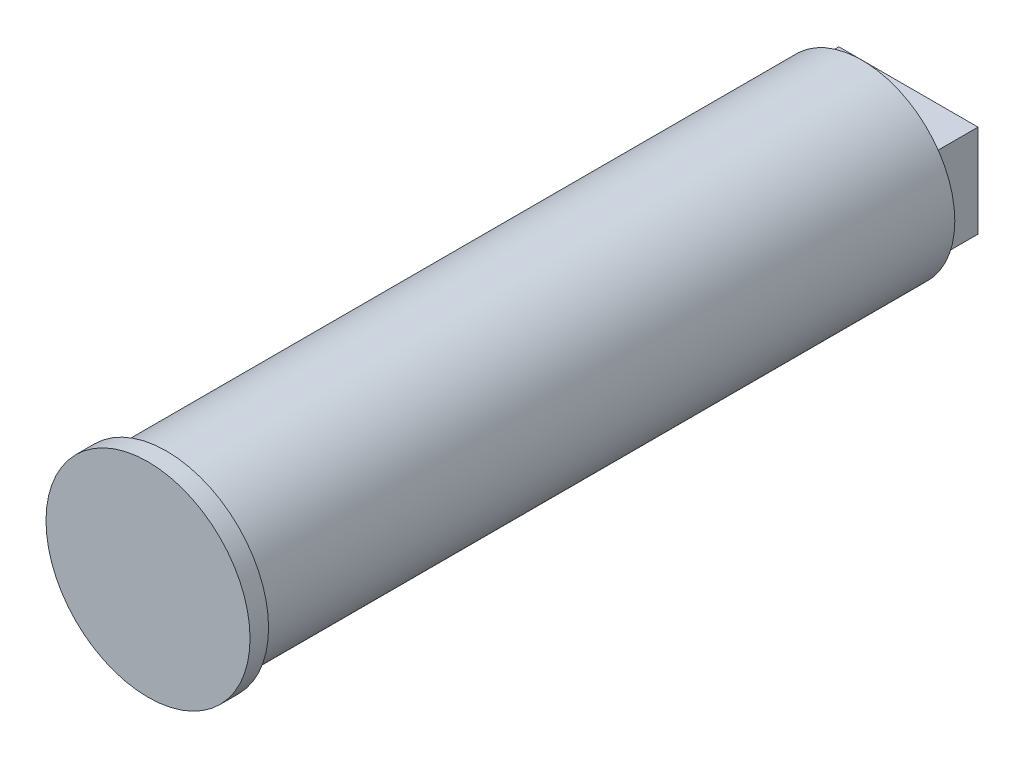
ISO-10303-21;
HEADER;
FILE_DESCRIPTION(('STEP AP214'),'2;1');
FILE_NAME('part.step','',(''),(''),'','','');
FILE_SCHEMA(('AUTOMOTIVE_DESIGN { 1 0 10303 214 1 1 1 1 }'));
ENDSEC;
DATA;
#1=APPLICATION_CONTEXT('core data for automotive mechanical design processes');
#2=APPLICATION_PROTOCOL_DEFINITION('international standard','automotive_design',2000,#1);
#3=PRODUCT_CONTEXT('',#1,'mechanical');
#4=PRODUCT('Part','Part','',(#3));
#5=PRODUCT_RELATED_PRODUCT_CATEGORY('part','',(#4));
#6=PRODUCT_DEFINITION_FORMATION('','',#4);
#7=PRODUCT_DEFINITION_CONTEXT('part definition',#1,'design');
#8=PRODUCT_DEFINITION('design','',#6,#7);
#9=PRODUCT_DEFINITION_SHAPE('','',#8);
#10=(LENGTH_UNIT() NAMED_UNIT(*) SI_UNIT(.MILLI.,.METRE.));
#11=(NAMED_UNIT(*) PLANE_ANGLE_UNIT() SI_UNIT($,.RADIAN.));
#12=(NAMED_UNIT(*) SI_UNIT($,.STERADIAN.) SOLID_ANGLE_UNIT());
#13=UNCERTAINTY_MEASURE_WITH_UNIT(LENGTH_MEASURE(1.E-05),#10,'distance_accuracy_value','');
#14=(GEOMETRIC_REPRESENTATION_CONTEXT(3) GLOBAL_UNCERTAINTY_ASSIGNED_CONTEXT((#13)) GLOBAL_UNIT_ASSIGNED_CONTEXT((#10,
#11,#12)) REPRESENTATION_CONTEXT('',''));
#15=CARTESIAN_POINT('',(0.,0.,0.));
#16=DIRECTION('',(0.,0.,1.));
#17=DIRECTION('',(1.,0.,0.));
#18=AXIS2_PLACEMENT_3D('',#15,#16,#17);
#19=CARTESIAN_POINT('',(0.,0.,0.));
#20=DIRECTION('',(0.,0.,1.));
#21=DIRECTION('',(1.,0.,0.));
#22=AXIS2_PLACEMENT_3D('',#19,#20,#21);
#23=PLANE('',#22);
#24=CARTESIAN_POINT('',(0.,0.,0.));
#25=DIRECTION('',(0.,0.,1.));
#26=DIRECTION('',(1.,0.,0.));
#27=AXIS2_PLACEMENT_3D('',#24,#25,#26);
#28=CIRCLE('',#27,10.);
#29=CARTESIAN_POINT('',(10.,0.,0.));
#30=VERTEX_POINT('',#29);
#31=EDGE_CURVE('E47',#30,#30,#28,.T.);
#32=ORIENTED_EDGE('',*,*,#31,.F.);
#33=EDGE_LOOP('',(#32));
#34=FACE_BOUND('',#33,.T.);
#35=DIRECTION('',(0.,-1.,0.));
#36=VECTOR('',#35,1.);
#37=CARTESIAN_POINT('',(7.5,5.,0.));
#38=LINE('',#37,#36);
#39=CARTESIAN_POINT('',(7.5,5.,0.));
#40=VERTEX_POINT('',#39);
#41=CARTESIAN_POINT('',(7.5,-5.,0.));
#42=VERTEX_POINT('',#41);
#43=EDGE_CURVE('E59',#40,#42,#38,.T.);
#44=ORIENTED_EDGE('',*,*,#43,.F.);
#45=DIRECTION('',(1.,0.,0.));
#46=VECTOR('',#45,1.);
#47=CARTESIAN_POINT('',(-7.5,5.,0.));
#48=LINE('',#47,#46);
#49=CARTESIAN_POINT('',(-7.5,5.,0.));
#50=VERTEX_POINT('',#49);
#51=EDGE_CURVE('E63',#50,#40,#48,.T.);
#52=ORIENTED_EDGE('',*,*,#51,.F.);
#53=DIRECTION('',(0.,1.,0.));
#54=VECTOR('',#53,1.);
#55=CARTESIAN_POINT('',(-7.5,5.,0.));
#56=LINE('',#55,#54);
#57=CARTESIAN_POINT('',(-7.5,-5.,0.));
#58=VERTEX_POINT('',#57);
#59=EDGE_CURVE('E240',#58,#50,#56,.T.);
#60=ORIENTED_EDGE('',*,*,#59,.F.);
#61=DIRECTION('',(-1.,0.,0.));
#62=VECTOR('',#61,1.);
#63=CARTESIAN_POINT('',(-7.5,-5.,0.));
#64=LINE('',#63,#62);
#65=EDGE_CURVE('E250',#42,#58,#64,.T.);
#66=ORIENTED_EDGE('',*,*,#65,.F.);
#67=EDGE_LOOP('',(#44,#52,#60,#66));
#68=FACE_BOUND('',#67,.T.);
#69=ADVANCED_FACE('F43',(#34,#68),#23,.F.);
#70=CARTESIAN_POINT('',(0.,0.,75.));
#71=DIRECTION('',(0.,0.,-1.));
#72=DIRECTION('',(-1.,0.,0.));
#73=AXIS2_PLACEMENT_3D('',#70,#71,#72);
#74=CYLINDRICAL_SURFACE('',#73,10.);
#75=CARTESIAN_POINT('',(0.,0.,75.));
#76=DIRECTION('',(0.,0.,1.));
#77=DIRECTION('',(1.,0.,0.));
#78=AXIS2_PLACEMENT_3D('',#75,#76,#77);
#79=CIRCLE('',#78,10.);
#80=CARTESIAN_POINT('',(10.,0.,75.));
#81=VERTEX_POINT('',#80);
#82=EDGE_CURVE('E11',#81,#81,#79,.T.);
#83=ORIENTED_EDGE('',*,*,#82,.F.);
#84=EDGE_LOOP('',(#83));
#85=FACE_BOUND('',#84,.T.);
#86=ORIENTED_EDGE('',*,*,#31,.T.);
#87=EDGE_LOOP('',(#86));
#88=FACE_BOUND('',#87,.T.);
#89=ADVANCED_FACE('F45',(#85,#88),#74,.T.);
#90=CARTESIAN_POINT('',(0.,0.,77.));
#91=DIRECTION('',(0.,0.,-1.));
#92=DIRECTION('',(-1.,0.,0.));
#93=AXIS2_PLACEMENT_3D('',#90,#91,#92);
#94=CYLINDRICAL_SURFACE('',#93,11.);
#95=CARTESIAN_POINT('',(0.,0.,77.));
#96=DIRECTION('',(0.,0.,1.));
#97=DIRECTION('',(1.,0.,0.));
#98=AXIS2_PLACEMENT_3D('',#95,#96,#97);
#99=CIRCLE('',#98,11.);
#100=CARTESIAN_POINT('',(11.,0.,77.));
#101=VERTEX_POINT('',#100);
#102=EDGE_CURVE('E113',#101,#101,#99,.T.);
#103=ORIENTED_EDGE('',*,*,#102,.F.);
#104=EDGE_LOOP('',(#103));
#105=FACE_BOUND('',#104,.T.);
#106=CARTESIAN_POINT('',(0.,0.,75.));
#107=DIRECTION('',(0.,0.,1.));
#108=DIRECTION('',(1.,0.,0.));
#109=AXIS2_PLACEMENT_3D('',#106,#107,#108);
#110=CIRCLE('',#109,11.);
#111=CARTESIAN_POINT('',(11.,0.,75.));
#112=VERTEX_POINT('',#111);
#113=EDGE_CURVE('E108',#112,#112,#110,.T.);
#114=ORIENTED_EDGE('',*,*,#113,.T.);
#115=EDGE_LOOP('',(#114));
#116=FACE_BOUND('',#115,.T.);
#117=ADVANCED_FACE('F132',(#105,#116),#94,.T.);
#118=CARTESIAN_POINT('',(0.,0.,77.));
#119=DIRECTION('',(0.,0.,1.));
#120=DIRECTION('',(1.,0.,0.));
#121=AXIS2_PLACEMENT_3D('',#118,#119,#120);
#122=PLANE('',#121);
#123=ORIENTED_EDGE('',*,*,#102,.T.);
#124=EDGE_LOOP('',(#123));
#125=FACE_BOUND('',#124,.T.);
#126=ADVANCED_FACE('F137',(#125),#122,.T.);
#127=CARTESIAN_POINT('',(0.,0.,75.));
#128=DIRECTION('',(0.,0.,1.));
#129=DIRECTION('',(1.,0.,0.));
#130=AXIS2_PLACEMENT_3D('',#127,#128,#129);
#131=PLANE('',#130);
#132=ORIENTED_EDGE('',*,*,#82,.T.);
#133=EDGE_LOOP('',(#132));
#134=FACE_BOUND('',#133,.T.);
#135=ORIENTED_EDGE('',*,*,#113,.F.);
#136=EDGE_LOOP('',(#135));
#137=FACE_BOUND('',#136,.T.);
#138=ADVANCED_FACE('F139',(#134,#137),#131,.F.);
#139=CARTESIAN_POINT('',(7.5,5.,-5.));
#140=DIRECTION('',(-1.,0.,0.));
#141=DIRECTION('',(0.,-1.,0.));
#142=AXIS2_PLACEMENT_3D('',#139,#140,#141);
#143=PLANE('',#142);
#144=ORIENTED_EDGE('',*,*,#43,.T.);
#145=DIRECTION('',(0.,0.,1.));
#146=VECTOR('',#145,1.);
#147=CARTESIAN_POINT('',(7.5,-5.,-5.));
#148=LINE('',#147,#146);
#149=CARTESIAN_POINT('',(7.5,-5.,-5.));
#150=VERTEX_POINT('',#149);
#151=EDGE_CURVE('E88',#150,#42,#148,.T.);
#152=ORIENTED_EDGE('',*,*,#151,.F.);
#153=DIRECTION('',(0.,-1.,0.));
#154=VECTOR('',#153,1.);
#155=CARTESIAN_POINT('',(7.5,5.,-5.));
#156=LINE('',#155,#154);
#157=CARTESIAN_POINT('',(7.5,5.,-5.));
#158=VERTEX_POINT('',#157);
#159=EDGE_CURVE('E95',#158,#150,#156,.T.);
#160=ORIENTED_EDGE('',*,*,#159,.F.);
#161=DIRECTION('',(0.,0.,1.));
#162=VECTOR('',#161,1.);
#163=CARTESIAN_POINT('',(7.5,5.,-5.));
#164=LINE('',#163,#162);
#165=EDGE_CURVE('E237',#158,#40,#164,.T.);
#166=ORIENTED_EDGE('',*,*,#165,.T.);
#167=EDGE_LOOP('',(#144,#152,#160,#166));
#168=FACE_BOUND('',#167,.T.);
#169=ADVANCED_FACE('F106',(#168),#143,.F.);
#170=CARTESIAN_POINT('',(-7.5,-5.,-5.));
#171=DIRECTION('',(0.,1.,0.));
#172=DIRECTION('',(-1.,0.,0.));
#173=AXIS2_PLACEMENT_3D('',#170,#171,#172);
#174=PLANE('',#173);
#175=ORIENTED_EDGE('',*,*,#65,.T.);
#176=DIRECTION('',(0.,0.,1.));
#177=VECTOR('',#176,1.);
#178=CARTESIAN_POINT('',(-7.5,-5.,-5.));
#179=LINE('',#178,#177);
#180=CARTESIAN_POINT('',(-7.5,-5.,-5.));
#181=VERTEX_POINT('',#180);
#182=EDGE_CURVE('E90',#181,#58,#179,.T.);
#183=ORIENTED_EDGE('',*,*,#182,.F.);
#184=DIRECTION('',(-1.,0.,0.));
#185=VECTOR('',#184,1.);
#186=CARTESIAN_POINT('',(-7.5,-5.,-5.));
#187=LINE('',#186,#185);
#188=EDGE_CURVE('E83',#150,#181,#187,.T.);
#189=ORIENTED_EDGE('',*,*,#188,.F.);
#190=ORIENTED_EDGE('',*,*,#151,.T.);
#191=EDGE_LOOP('',(#175,#183,#189,#190));
#192=FACE_BOUND('',#191,.T.);
#193=ADVANCED_FACE('F86',(#192),#174,.F.);
#194=CARTESIAN_POINT('',(-7.5,5.,-5.));
#195=DIRECTION('',(1.,0.,0.));
#196=DIRECTION('',(0.,1.,0.));
#197=AXIS2_PLACEMENT_3D('',#194,#195,#196);
#198=PLANE('',#197);
#199=ORIENTED_EDGE('',*,*,#59,.T.);
#200=DIRECTION('',(0.,0.,1.));
#201=VECTOR('',#200,1.);
#202=CARTESIAN_POINT('',(-7.5,5.,-5.));
#203=LINE('',#202,#201);
#204=CARTESIAN_POINT('',(-7.5,5.,-5.));
#205=VERTEX_POINT('',#204);
#206=EDGE_CURVE('E115',#205,#50,#203,.T.);
#207=ORIENTED_EDGE('',*,*,#206,.F.);
#208=DIRECTION('',(0.,1.,0.));
#209=VECTOR('',#208,1.);
#210=CARTESIAN_POINT('',(-7.5,5.,-5.));
#211=LINE('',#210,#209);
#212=EDGE_CURVE('E94',#181,#205,#211,.T.);
#213=ORIENTED_EDGE('',*,*,#212,.F.);
#214=ORIENTED_EDGE('',*,*,#182,.T.);
#215=EDGE_LOOP('',(#199,#207,#213,#214));
#216=FACE_BOUND('',#215,.T.);
#217=ADVANCED_FACE('F149',(#216),#198,.F.);
#218=CARTESIAN_POINT('',(-7.5,5.,-5.));
#219=DIRECTION('',(0.,-1.,0.));
#220=DIRECTION('',(1.,0.,0.));
#221=AXIS2_PLACEMENT_3D('',#218,#219,#220);
#222=PLANE('',#221);
#223=ORIENTED_EDGE('',*,*,#51,.T.);
#224=ORIENTED_EDGE('',*,*,#165,.F.);
#225=DIRECTION('',(1.,0.,0.));
#226=VECTOR('',#225,1.);
#227=CARTESIAN_POINT('',(-7.5,5.,-5.));
#228=LINE('',#227,#226);
#229=EDGE_CURVE('E100',#205,#158,#228,.T.);
#230=ORIENTED_EDGE('',*,*,#229,.F.);
#231=ORIENTED_EDGE('',*,*,#206,.T.);
#232=EDGE_LOOP('',(#223,#224,#230,#231));
#233=FACE_BOUND('',#232,.T.);
#234=ADVANCED_FACE('F152',(#233),#222,.F.);
#235=CARTESIAN_POINT('',(0.,0.,-5.));
#236=DIRECTION('',(0.,0.,1.));
#237=DIRECTION('',(1.,0.,0.));
#238=AXIS2_PLACEMENT_3D('',#235,#236,#237);
#239=PLANE('',#238);
#240=ORIENTED_EDGE('',*,*,#159,.T.);
#241=ORIENTED_EDGE('',*,*,#188,.T.);
#242=ORIENTED_EDGE('',*,*,#212,.T.);
#243=ORIENTED_EDGE('',*,*,#229,.T.);
#244=EDGE_LOOP('',(#240,#241,#242,#243));
#245=FACE_BOUND('',#244,.T.);
#246=ADVANCED_FACE('F98',(#245),#239,.F.);
#247=CLOSED_SHELL('',(#69,#89,#117,#126,#138,#169,#193,#217,#234,#246));
#248=MANIFOLD_SOLID_BREP('B2',#247);
#249=ADVANCED_BREP_SHAPE_REPRESENTATION('',(#18,#248),#14);
#250=SHAPE_DEFINITION_REPRESENTATION(#9,#249);
ENDSEC;
END-ISO-10303-21;
